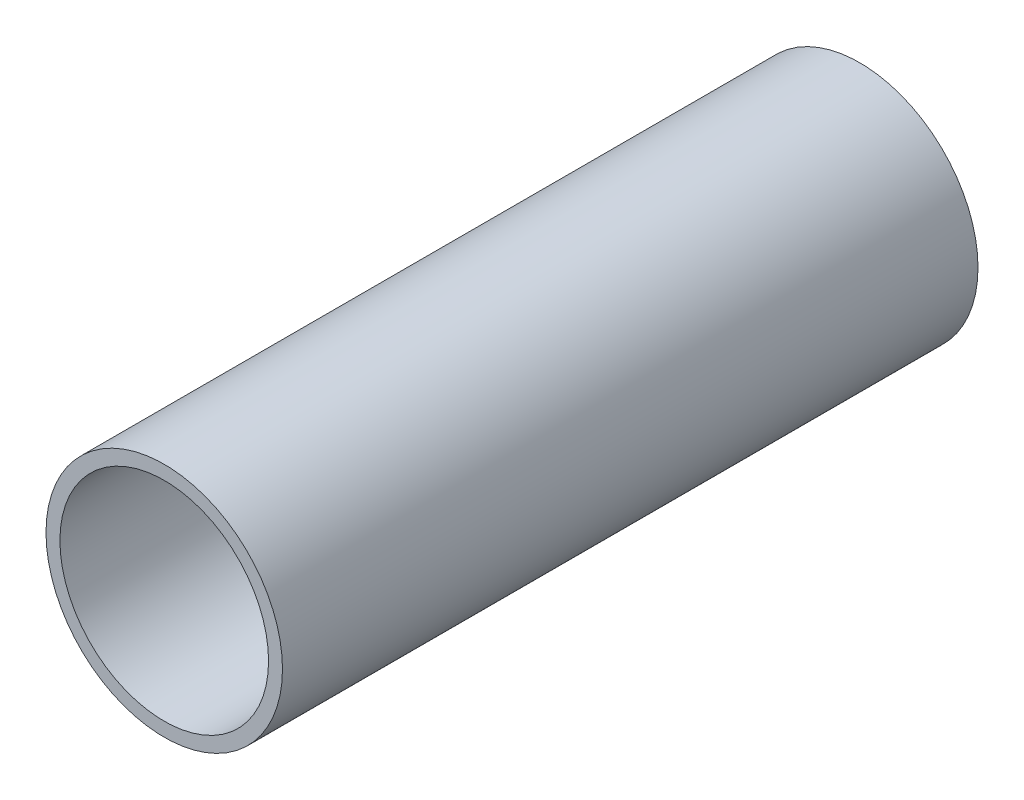
ISO-10303-21;
HEADER;
FILE_DESCRIPTION(('STEP AP214'),'2;1');
FILE_NAME('part.step','',(''),(''),'','','');
FILE_SCHEMA(('AUTOMOTIVE_DESIGN { 1 0 10303 214 1 1 1 1 }'));
ENDSEC;
DATA;
#1=APPLICATION_CONTEXT('core data for automotive mechanical design processes');
#2=APPLICATION_PROTOCOL_DEFINITION('international standard','automotive_design',2000,#1);
#3=PRODUCT_CONTEXT('',#1,'mechanical');
#4=PRODUCT('Part','Part','',(#3));
#5=PRODUCT_RELATED_PRODUCT_CATEGORY('part','',(#4));
#6=PRODUCT_DEFINITION_FORMATION('','',#4);
#7=PRODUCT_DEFINITION_CONTEXT('part definition',#1,'design');
#8=PRODUCT_DEFINITION('design','',#6,#7);
#9=PRODUCT_DEFINITION_SHAPE('','',#8);
#10=(LENGTH_UNIT() NAMED_UNIT(*) SI_UNIT(.MILLI.,.METRE.));
#11=(NAMED_UNIT(*) PLANE_ANGLE_UNIT() SI_UNIT($,.RADIAN.));
#12=(NAMED_UNIT(*) SI_UNIT($,.STERADIAN.) SOLID_ANGLE_UNIT());
#13=UNCERTAINTY_MEASURE_WITH_UNIT(LENGTH_MEASURE(1.E-05),#10,'distance_accuracy_value','');
#14=(GEOMETRIC_REPRESENTATION_CONTEXT(3) GLOBAL_UNCERTAINTY_ASSIGNED_CONTEXT((#13)) GLOBAL_UNIT_ASSIGNED_CONTEXT((#10,
#11,#12)) REPRESENTATION_CONTEXT('',''));
#15=CARTESIAN_POINT('',(0.,0.,0.));
#16=DIRECTION('',(0.,0.,1.));
#17=DIRECTION('',(1.,0.,0.));
#18=AXIS2_PLACEMENT_3D('',#15,#16,#17);
#19=CARTESIAN_POINT('',(0.,0.,200.));
#20=DIRECTION('',(0.,0.,1.));
#21=DIRECTION('',(1.,0.,0.));
#22=AXIS2_PLACEMENT_3D('',#19,#20,#21);
#23=PLANE('',#22);
#24=CARTESIAN_POINT('',(0.,0.,200.));
#25=DIRECTION('',(0.,0.,1.));
#26=DIRECTION('',(1.,0.,0.));
#27=AXIS2_PLACEMENT_3D('',#24,#25,#26);
#28=CIRCLE('',#27,34.);
#29=CARTESIAN_POINT('',(34.,0.,200.));
#30=VERTEX_POINT('',#29);
#31=EDGE_CURVE('E10',#30,#30,#28,.T.);
#32=ORIENTED_EDGE('',*,*,#31,.T.);
#33=EDGE_LOOP('',(#32));
#34=FACE_BOUND('',#33,.T.);
#35=CARTESIAN_POINT('',(0.,0.,200.));
#36=DIRECTION('',(0.,0.,1.));
#37=DIRECTION('',(1.,0.,0.));
#38=AXIS2_PLACEMENT_3D('',#35,#36,#37);
#39=CIRCLE('',#38,30.);
#40=CARTESIAN_POINT('',(30.,0.,200.));
#41=VERTEX_POINT('',#40);
#42=EDGE_CURVE('E48',#41,#41,#39,.T.);
#43=ORIENTED_EDGE('',*,*,#42,.F.);
#44=EDGE_LOOP('',(#43));
#45=FACE_BOUND('',#44,.T.);
#46=ADVANCED_FACE('F37',(#34,#45),#23,.T.);
#47=CARTESIAN_POINT('',(0.,0.,0.));
#48=DIRECTION('',(0.,0.,1.));
#49=DIRECTION('',(1.,0.,0.));
#50=AXIS2_PLACEMENT_3D('',#47,#48,#49);
#51=PLANE('',#50);
#52=CARTESIAN_POINT('',(0.,0.,0.));
#53=DIRECTION('',(0.,0.,1.));
#54=DIRECTION('',(1.,0.,0.));
#55=AXIS2_PLACEMENT_3D('',#52,#53,#54);
#56=CIRCLE('',#55,34.);
#57=CARTESIAN_POINT('',(34.,0.,0.));
#58=VERTEX_POINT('',#57);
#59=EDGE_CURVE('E41',#58,#58,#56,.T.);
#60=ORIENTED_EDGE('',*,*,#59,.F.);
#61=EDGE_LOOP('',(#60));
#62=FACE_BOUND('',#61,.T.);
#63=CARTESIAN_POINT('',(0.,0.,0.));
#64=DIRECTION('',(0.,0.,1.));
#65=DIRECTION('',(1.,0.,0.));
#66=AXIS2_PLACEMENT_3D('',#63,#64,#65);
#67=CIRCLE('',#66,30.);
#68=CARTESIAN_POINT('',(30.,0.,0.));
#69=VERTEX_POINT('',#68);
#70=EDGE_CURVE('E50',#69,#69,#67,.T.);
#71=ORIENTED_EDGE('',*,*,#70,.T.);
#72=EDGE_LOOP('',(#71));
#73=FACE_BOUND('',#72,.T.);
#74=ADVANCED_FACE('F60',(#62,#73),#51,.F.);
#75=CARTESIAN_POINT('',(0.,0.,200.));
#76=DIRECTION('',(0.,0.,-1.));
#77=DIRECTION('',(-1.,0.,0.));
#78=AXIS2_PLACEMENT_3D('',#75,#76,#77);
#79=CYLINDRICAL_SURFACE('',#78,34.);
#80=ORIENTED_EDGE('',*,*,#31,.F.);
#81=EDGE_LOOP('',(#80));
#82=FACE_BOUND('',#81,.T.);
#83=ORIENTED_EDGE('',*,*,#59,.T.);
#84=EDGE_LOOP('',(#83));
#85=FACE_BOUND('',#84,.T.);
#86=ADVANCED_FACE('F39',(#82,#85),#79,.T.);
#87=CARTESIAN_POINT('',(0.,0.,200.));
#88=DIRECTION('',(0.,0.,-1.));
#89=DIRECTION('',(-1.,0.,0.));
#90=AXIS2_PLACEMENT_3D('',#87,#88,#89);
#91=CYLINDRICAL_SURFACE('',#90,30.);
#92=ORIENTED_EDGE('',*,*,#42,.T.);
#93=EDGE_LOOP('',(#92));
#94=FACE_BOUND('',#93,.T.);
#95=ORIENTED_EDGE('',*,*,#70,.F.);
#96=EDGE_LOOP('',(#95));
#97=FACE_BOUND('',#96,.T.);
#98=ADVANCED_FACE('F56',(#94,#97),#91,.F.);
#99=CLOSED_SHELL('',(#46,#74,#86,#98));
#100=MANIFOLD_SOLID_BREP('B2',#99);
#101=ADVANCED_BREP_SHAPE_REPRESENTATION('',(#18,#100),#14);
#102=SHAPE_DEFINITION_REPRESENTATION(#9,#101);
ENDSEC;
END-ISO-10303-21;
